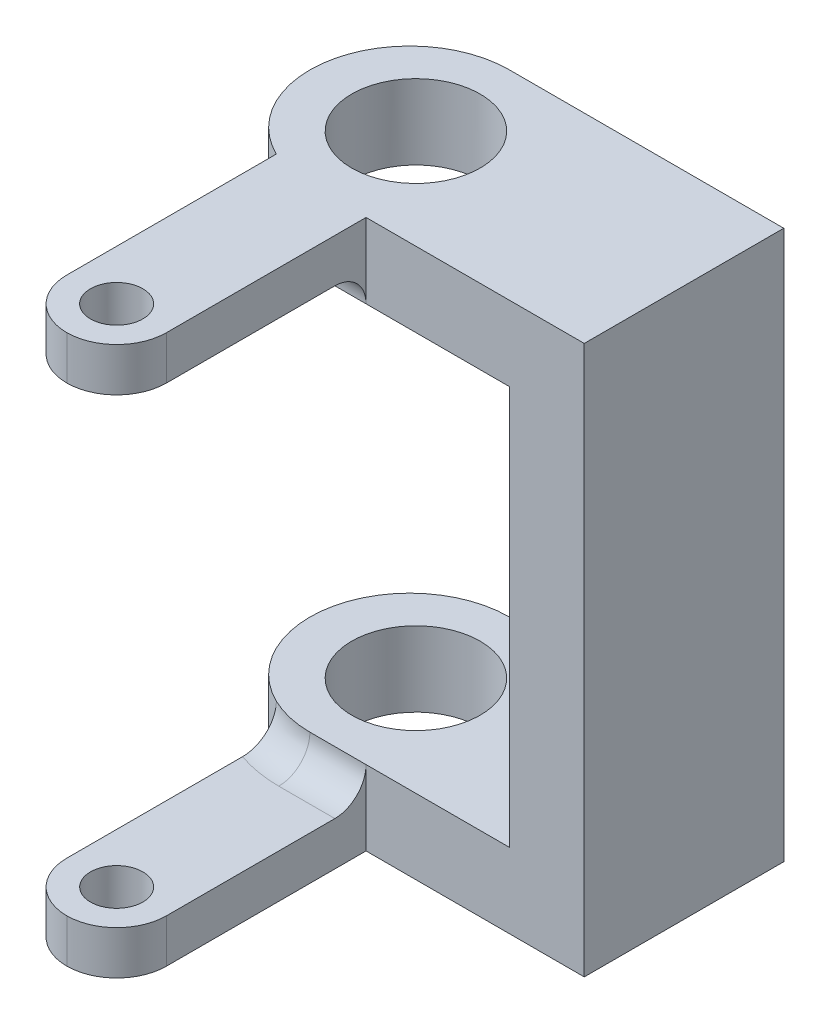
ISO-10303-21;
HEADER;
FILE_DESCRIPTION(('STEP AP214'),'2;1');
FILE_NAME('part.step','',(''),(''),'','','');
FILE_SCHEMA(('AUTOMOTIVE_DESIGN { 1 0 10303 214 1 1 1 1 }'));
ENDSEC;
DATA;
#1=APPLICATION_CONTEXT('core data for automotive mechanical design processes');
#2=APPLICATION_PROTOCOL_DEFINITION('international standard','automotive_design',2000,#1);
#3=PRODUCT_CONTEXT('',#1,'mechanical');
#4=PRODUCT('Part','Part','',(#3));
#5=PRODUCT_RELATED_PRODUCT_CATEGORY('part','',(#4));
#6=PRODUCT_DEFINITION_FORMATION('','',#4);
#7=PRODUCT_DEFINITION_CONTEXT('part definition',#1,'design');
#8=PRODUCT_DEFINITION('design','',#6,#7);
#9=PRODUCT_DEFINITION_SHAPE('','',#8);
#10=(LENGTH_UNIT() NAMED_UNIT(*) SI_UNIT(.MILLI.,.METRE.));
#11=(NAMED_UNIT(*) PLANE_ANGLE_UNIT() SI_UNIT($,.RADIAN.));
#12=(NAMED_UNIT(*) SI_UNIT($,.STERADIAN.) SOLID_ANGLE_UNIT());
#13=UNCERTAINTY_MEASURE_WITH_UNIT(LENGTH_MEASURE(1.E-05),#10,'distance_accuracy_value','');
#14=(GEOMETRIC_REPRESENTATION_CONTEXT(3) GLOBAL_UNCERTAINTY_ASSIGNED_CONTEXT((#13)) GLOBAL_UNIT_ASSIGNED_CONTEXT((#10,
#11,#12)) REPRESENTATION_CONTEXT('',''));
#15=CARTESIAN_POINT('',(0.,0.,0.));
#16=DIRECTION('',(0.,0.,1.));
#17=DIRECTION('',(1.,0.,0.));
#18=AXIS2_PLACEMENT_3D('',#15,#16,#17);
#19=CARTESIAN_POINT('',(-1.5,8.,4.));
#20=DIRECTION('',(0.,0.,-1.));
#21=DIRECTION('',(-1.,0.,0.));
#22=AXIS2_PLACEMENT_3D('',#19,#20,#21);
#23=PLANE('',#22);
#24=DIRECTION('',(1.,0.,0.));
#25=VECTOR('',#24,1.);
#26=CARTESIAN_POINT('',(1.5,-8.,4.));
#27=LINE('',#26,#25);
#28=CARTESIAN_POINT('',(-7.25,-8.,4.));
#29=VERTEX_POINT('',#28);
#30=CARTESIAN_POINT('',(-1.5,-8.,4.));
#31=VERTEX_POINT('',#30);
#32=EDGE_CURVE('E205',#29,#31,#27,.T.);
#33=ORIENTED_EDGE('',*,*,#32,.F.);
#34=DIRECTION('',(0.,-1.,0.));
#35=VECTOR('',#34,1.);
#36=CARTESIAN_POINT('',(-7.25,-9.25,4.));
#37=LINE('',#36,#35);
#38=CARTESIAN_POINT('',(-7.25,-11.,4.));
#39=VERTEX_POINT('',#38);
#40=EDGE_CURVE('E190',#29,#39,#37,.T.);
#41=ORIENTED_EDGE('',*,*,#40,.T.);
#42=DIRECTION('',(1.,0.,0.));
#43=VECTOR('',#42,1.);
#44=CARTESIAN_POINT('',(1.5,-11.,4.));
#45=LINE('',#44,#43);
#46=CARTESIAN_POINT('',(1.5,-11.,4.));
#47=VERTEX_POINT('',#46);
#48=EDGE_CURVE('E202',#39,#47,#45,.T.);
#49=ORIENTED_EDGE('',*,*,#48,.T.);
#50=DIRECTION('',(0.,-1.,0.));
#51=VECTOR('',#50,1.);
#52=CARTESIAN_POINT('',(1.5,8.,4.));
#53=LINE('',#52,#51);
#54=CARTESIAN_POINT('',(1.5,11.,4.));
#55=VERTEX_POINT('',#54);
#56=EDGE_CURVE('E278',#55,#47,#53,.T.);
#57=ORIENTED_EDGE('',*,*,#56,.F.);
#58=DIRECTION('',(1.,0.,0.));
#59=VECTOR('',#58,1.);
#60=CARTESIAN_POINT('',(1.5,11.,4.));
#61=LINE('',#60,#59);
#62=CARTESIAN_POINT('',(-7.25,11.,4.));
#63=VERTEX_POINT('',#62);
#64=EDGE_CURVE('E261',#63,#55,#61,.T.);
#65=ORIENTED_EDGE('',*,*,#64,.F.);
#66=DIRECTION('',(0.,1.,0.));
#67=VECTOR('',#66,1.);
#68=CARTESIAN_POINT('',(-7.25,9.25,4.));
#69=LINE('',#68,#67);
#70=CARTESIAN_POINT('',(-7.25,8.,4.));
#71=VERTEX_POINT('',#70);
#72=EDGE_CURVE('E238',#71,#63,#69,.T.);
#73=ORIENTED_EDGE('',*,*,#72,.F.);
#74=DIRECTION('',(1.,0.,0.));
#75=VECTOR('',#74,1.);
#76=CARTESIAN_POINT('',(1.5,8.,4.));
#77=LINE('',#76,#75);
#78=CARTESIAN_POINT('',(-1.5,8.,4.));
#79=VERTEX_POINT('',#78);
#80=EDGE_CURVE('E260',#71,#79,#77,.T.);
#81=ORIENTED_EDGE('',*,*,#80,.T.);
#82=DIRECTION('',(0.,-1.,0.));
#83=VECTOR('',#82,1.);
#84=CARTESIAN_POINT('',(-1.5,8.,4.));
#85=LINE('',#84,#83);
#86=EDGE_CURVE('E280',#79,#31,#85,.T.);
#87=ORIENTED_EDGE('',*,*,#86,.T.);
#88=EDGE_LOOP('',(#33,#41,#49,#57,#65,#73,#81,#87));
#89=FACE_BOUND('',#88,.T.);
#90=ADVANCED_FACE('F35',(#89),#23,.F.);
#91=CARTESIAN_POINT('',(-9.5,-11.,0.));
#92=DIRECTION('',(0.,-1.,0.));
#93=DIRECTION('',(0.,0.,-1.));
#94=AXIS2_PLACEMENT_3D('',#91,#92,#93);
#95=CYLINDRICAL_SURFACE('',#94,4.);
#96=DIRECTION('',(0.,1.,0.));
#97=VECTOR('',#96,1.);
#98=CARTESIAN_POINT('',(-11.25,-8.,3.59687364248454));
#99=LINE('',#98,#97);
#100=CARTESIAN_POINT('',(-11.25,-8.,3.59687364248454));
#101=VERTEX_POINT('',#100);
#102=CARTESIAN_POINT('',(-11.25,-11.,3.59687364248454));
#103=VERTEX_POINT('',#102);
#104=EDGE_CURVE('E52',#101,#103,#99,.F.);
#105=ORIENTED_EDGE('',*,*,#104,.F.);
#106=CARTESIAN_POINT('',(-9.5,-8.,0.));
#107=DIRECTION('',(0.,1.,0.));
#108=DIRECTION('',(0.,0.,1.));
#109=AXIS2_PLACEMENT_3D('',#106,#107,#108);
#110=CIRCLE('',#109,4.);
#111=CARTESIAN_POINT('',(-13.5,-8.,0.));
#112=VERTEX_POINT('',#111);
#113=EDGE_CURVE('E509',#112,#101,#110,.T.);
#114=ORIENTED_EDGE('',*,*,#113,.F.);
#115=DIRECTION('',(0.,1.,0.));
#116=VECTOR('',#115,1.);
#117=CARTESIAN_POINT('',(-13.5,-11.,0.));
#118=LINE('',#117,#116);
#119=CARTESIAN_POINT('',(-13.5,-11.,0.));
#120=VERTEX_POINT('',#119);
#121=EDGE_CURVE('E434',#112,#120,#118,.F.);
#122=ORIENTED_EDGE('',*,*,#121,.T.);
#123=CARTESIAN_POINT('',(-9.5,-11.,0.));
#124=DIRECTION('',(0.,1.,0.));
#125=DIRECTION('',(0.,0.,1.));
#126=AXIS2_PLACEMENT_3D('',#123,#124,#125);
#127=CIRCLE('',#126,4.);
#128=EDGE_CURVE('E425',#103,#120,#127,.F.);
#129=ORIENTED_EDGE('',*,*,#128,.F.);
#130=EDGE_LOOP('',(#105,#114,#122,#129));
#131=FACE_BOUND('',#130,.T.);
#132=ADVANCED_FACE('F366',(#131),#95,.T.);
#133=CARTESIAN_POINT('',(1.5,8.,4.));
#134=DIRECTION('',(-1.,0.,0.));
#135=DIRECTION('',(0.,0.,1.));
#136=AXIS2_PLACEMENT_3D('',#133,#134,#135);
#137=PLANE('',#136);
#138=ORIENTED_EDGE('',*,*,#56,.T.);
#139=DIRECTION('',(0.,0.,-1.));
#140=VECTOR('',#139,1.);
#141=CARTESIAN_POINT('',(1.5,-11.,4.));
#142=LINE('',#141,#140);
#143=CARTESIAN_POINT('',(1.5,-11.,-4.));
#144=VERTEX_POINT('',#143);
#145=EDGE_CURVE('E214',#47,#144,#142,.T.);
#146=ORIENTED_EDGE('',*,*,#145,.T.);
#147=DIRECTION('',(0.,-1.,0.));
#148=VECTOR('',#147,1.);
#149=CARTESIAN_POINT('',(1.5,8.,-4.));
#150=LINE('',#149,#148);
#151=CARTESIAN_POINT('',(1.5,11.,-4.));
#152=VERTEX_POINT('',#151);
#153=EDGE_CURVE('E285',#152,#144,#150,.T.);
#154=ORIENTED_EDGE('',*,*,#153,.F.);
#155=DIRECTION('',(0.,0.,-1.));
#156=VECTOR('',#155,1.);
#157=CARTESIAN_POINT('',(1.5,11.,4.));
#158=LINE('',#157,#156);
#159=EDGE_CURVE('E263',#55,#152,#158,.T.);
#160=ORIENTED_EDGE('',*,*,#159,.F.);
#161=EDGE_LOOP('',(#138,#146,#154,#160));
#162=FACE_BOUND('',#161,.T.);
#163=ADVANCED_FACE('F373',(#162),#137,.F.);
#164=CARTESIAN_POINT('',(-1.5,8.,-4.));
#165=DIRECTION('',(0.,0.,1.));
#166=DIRECTION('',(1.,0.,0.));
#167=AXIS2_PLACEMENT_3D('',#164,#165,#166);
#168=PLANE('',#167);
#169=DIRECTION('',(-1.,0.,0.));
#170=VECTOR('',#169,1.);
#171=CARTESIAN_POINT('',(-13.5,-11.,-4.));
#172=LINE('',#171,#170);
#173=CARTESIAN_POINT('',(-9.5,-11.,-4.));
#174=VERTEX_POINT('',#173);
#175=EDGE_CURVE('E215',#144,#174,#172,.T.);
#176=ORIENTED_EDGE('',*,*,#175,.T.);
#177=DIRECTION('',(0.,1.,0.));
#178=VECTOR('',#177,1.);
#179=CARTESIAN_POINT('',(-9.5,-8.,-4.));
#180=LINE('',#179,#178);
#181=CARTESIAN_POINT('',(-9.5,-8.,-4.));
#182=VERTEX_POINT('',#181);
#183=EDGE_CURVE('E421',#174,#182,#180,.T.);
#184=ORIENTED_EDGE('',*,*,#183,.T.);
#185=DIRECTION('',(-1.,0.,0.));
#186=VECTOR('',#185,1.);
#187=CARTESIAN_POINT('',(-13.5,-8.,-4.));
#188=LINE('',#187,#186);
#189=CARTESIAN_POINT('',(-1.5,-8.,-4.));
#190=VERTEX_POINT('',#189);
#191=EDGE_CURVE('E216',#190,#182,#188,.T.);
#192=ORIENTED_EDGE('',*,*,#191,.F.);
#193=DIRECTION('',(0.,-1.,0.));
#194=VECTOR('',#193,1.);
#195=CARTESIAN_POINT('',(-1.5,8.,-4.));
#196=LINE('',#195,#194);
#197=CARTESIAN_POINT('',(-1.5,8.,-4.));
#198=VERTEX_POINT('',#197);
#199=EDGE_CURVE('E282',#198,#190,#196,.T.);
#200=ORIENTED_EDGE('',*,*,#199,.F.);
#201=DIRECTION('',(-1.,0.,0.));
#202=VECTOR('',#201,1.);
#203=CARTESIAN_POINT('',(-13.5,8.,-4.));
#204=LINE('',#203,#202);
#205=CARTESIAN_POINT('',(-9.5,8.,-4.));
#206=VERTEX_POINT('',#205);
#207=EDGE_CURVE('E264',#198,#206,#204,.T.);
#208=ORIENTED_EDGE('',*,*,#207,.T.);
#209=DIRECTION('',(0.,-1.,0.));
#210=VECTOR('',#209,1.);
#211=CARTESIAN_POINT('',(-9.5,8.,-4.));
#212=LINE('',#211,#210);
#213=CARTESIAN_POINT('',(-9.5,11.,-4.));
#214=VERTEX_POINT('',#213);
#215=EDGE_CURVE('E298',#206,#214,#212,.F.);
#216=ORIENTED_EDGE('',*,*,#215,.T.);
#217=DIRECTION('',(-1.,0.,0.));
#218=VECTOR('',#217,1.);
#219=CARTESIAN_POINT('',(-13.5,11.,-4.));
#220=LINE('',#219,#218);
#221=EDGE_CURVE('E267',#152,#214,#220,.T.);
#222=ORIENTED_EDGE('',*,*,#221,.F.);
#223=ORIENTED_EDGE('',*,*,#153,.T.);
#224=EDGE_LOOP('',(#176,#184,#192,#200,#208,#216,#222,#223));
#225=FACE_BOUND('',#224,.T.);
#226=ADVANCED_FACE('F369',(#225),#168,.F.);
#227=CARTESIAN_POINT('',(-1.5,8.,4.));
#228=DIRECTION('',(1.,0.,0.));
#229=DIRECTION('',(0.,0.,-1.));
#230=AXIS2_PLACEMENT_3D('',#227,#228,#229);
#231=PLANE('',#230);
#232=ORIENTED_EDGE('',*,*,#199,.T.);
#233=DIRECTION('',(0.,0.,1.));
#234=VECTOR('',#233,1.);
#235=CARTESIAN_POINT('',(-1.5,-8.,4.));
#236=LINE('',#235,#234);
#237=EDGE_CURVE('E228',#190,#31,#236,.T.);
#238=ORIENTED_EDGE('',*,*,#237,.T.);
#239=ORIENTED_EDGE('',*,*,#86,.F.);
#240=DIRECTION('',(0.,0.,1.));
#241=VECTOR('',#240,1.);
#242=CARTESIAN_POINT('',(-1.5,8.,4.));
#243=LINE('',#242,#241);
#244=EDGE_CURVE('E270',#198,#79,#243,.T.);
#245=ORIENTED_EDGE('',*,*,#244,.F.);
#246=EDGE_LOOP('',(#232,#238,#239,#245));
#247=FACE_BOUND('',#246,.T.);
#248=ADVANCED_FACE('F359',(#247),#231,.F.);
#249=CARTESIAN_POINT('',(0.,11.,0.));
#250=DIRECTION('',(0.,-1.,0.));
#251=DIRECTION('',(0.,0.,-1.));
#252=AXIS2_PLACEMENT_3D('',#249,#250,#251);
#253=PLANE('',#252);
#254=CARTESIAN_POINT('',(-9.25,11.,12.));
#255=DIRECTION('',(0.,1.,0.));
#256=DIRECTION('',(0.,0.,1.));
#257=AXIS2_PLACEMENT_3D('',#254,#255,#256);
#258=CIRCLE('',#257,1.05);
#259=CARTESIAN_POINT('',(-9.25,11.,13.05));
#260=VERTEX_POINT('',#259);
#261=EDGE_CURVE('E233',#260,#260,#258,.T.);
#262=ORIENTED_EDGE('',*,*,#261,.F.);
#263=EDGE_LOOP('',(#262));
#264=FACE_BOUND('',#263,.T.);
#265=DIRECTION('',(0.,0.,1.));
#266=VECTOR('',#265,1.);
#267=CARTESIAN_POINT('',(-11.25,11.,-4.001));
#268=LINE('',#267,#266);
#269=CARTESIAN_POINT('',(-11.25,11.,3.59687364248454));
#270=VERTEX_POINT('',#269);
#271=CARTESIAN_POINT('',(-11.25,11.,12.));
#272=VERTEX_POINT('',#271);
#273=EDGE_CURVE('E246',#270,#272,#268,.T.);
#274=ORIENTED_EDGE('',*,*,#273,.T.);
#275=CARTESIAN_POINT('',(-9.25,11.,12.));
#276=DIRECTION('',(0.,-1.,0.));
#277=DIRECTION('',(0.,0.,-1.));
#278=AXIS2_PLACEMENT_3D('',#275,#276,#277);
#279=CIRCLE('',#278,2.);
#280=CARTESIAN_POINT('',(-9.25,11.,14.));
#281=VERTEX_POINT('',#280);
#282=EDGE_CURVE('E314',#272,#281,#279,.F.);
#283=ORIENTED_EDGE('',*,*,#282,.T.);
#284=CARTESIAN_POINT('',(-9.25,11.,12.));
#285=DIRECTION('',(0.,-1.,0.));
#286=DIRECTION('',(0.,0.,-1.));
#287=AXIS2_PLACEMENT_3D('',#284,#285,#286);
#288=CIRCLE('',#287,2.);
#289=CARTESIAN_POINT('',(-7.25,11.,12.));
#290=VERTEX_POINT('',#289);
#291=EDGE_CURVE('E312',#281,#290,#288,.F.);
#292=ORIENTED_EDGE('',*,*,#291,.T.);
#293=DIRECTION('',(0.,0.,-1.));
#294=VECTOR('',#293,1.);
#295=CARTESIAN_POINT('',(-7.25,11.,14.));
#296=LINE('',#295,#294);
#297=EDGE_CURVE('E244',#290,#63,#296,.T.);
#298=ORIENTED_EDGE('',*,*,#297,.T.);
#299=ORIENTED_EDGE('',*,*,#64,.T.);
#300=ORIENTED_EDGE('',*,*,#159,.T.);
#301=ORIENTED_EDGE('',*,*,#221,.T.);
#302=CARTESIAN_POINT('',(-9.5,11.,0.));
#303=DIRECTION('',(0.,-1.,0.));
#304=DIRECTION('',(0.,0.,-1.));
#305=AXIS2_PLACEMENT_3D('',#302,#303,#304);
#306=CIRCLE('',#305,4.);
#307=CARTESIAN_POINT('',(-13.5,11.,0.));
#308=VERTEX_POINT('',#307);
#309=EDGE_CURVE('E293',#214,#308,#306,.F.);
#310=ORIENTED_EDGE('',*,*,#309,.T.);
#311=CARTESIAN_POINT('',(-9.5,11.,0.));
#312=DIRECTION('',(0.,-1.,0.));
#313=DIRECTION('',(0.,0.,-1.));
#314=AXIS2_PLACEMENT_3D('',#311,#312,#313);
#315=CIRCLE('',#314,4.);
#316=EDGE_CURVE('E295',#308,#270,#315,.F.);
#317=ORIENTED_EDGE('',*,*,#316,.T.);
#318=EDGE_LOOP('',(#274,#283,#292,#298,#299,#300,#301,#310,#317));
#319=FACE_BOUND('',#318,.T.);
#320=CARTESIAN_POINT('',(-9.25,11.,0.));
#321=DIRECTION('',(0.,1.,0.));
#322=DIRECTION('',(0.,0.,1.));
#323=AXIS2_PLACEMENT_3D('',#320,#321,#322);
#324=CIRCLE('',#323,2.575);
#325=CARTESIAN_POINT('',(-9.25,11.,2.575));
#326=VERTEX_POINT('',#325);
#327=EDGE_CURVE('E254',#326,#326,#324,.T.);
#328=ORIENTED_EDGE('',*,*,#327,.F.);
#329=EDGE_LOOP('',(#328));
#330=FACE_BOUND('',#329,.T.);
#331=ADVANCED_FACE('F356',(#264,#319,#330),#253,.F.);
#332=CARTESIAN_POINT('',(0.,8.,0.));
#333=DIRECTION('',(0.,-1.,0.));
#334=DIRECTION('',(0.,0.,-1.));
#335=AXIS2_PLACEMENT_3D('',#332,#333,#334);
#336=PLANE('',#335);
#337=CARTESIAN_POINT('',(-9.25,8.,0.));
#338=DIRECTION('',(0.,-1.,0.));
#339=DIRECTION('',(0.,0.,-1.));
#340=AXIS2_PLACEMENT_3D('',#337,#338,#339);
#341=CIRCLE('',#340,2.575);
#342=CARTESIAN_POINT('',(-9.25,8.,-2.575));
#343=VERTEX_POINT('',#342);
#344=EDGE_CURVE('E257',#343,#343,#341,.F.);
#345=ORIENTED_EDGE('',*,*,#344,.T.);
#346=EDGE_LOOP('',(#345));
#347=FACE_BOUND('',#346,.T.);
#348=CARTESIAN_POINT('',(-9.5,8.,4.));
#349=VERTEX_POINT('',#348);
#350=EDGE_CURVE('E271',#349,#71,#77,.T.);
#351=ORIENTED_EDGE('',*,*,#350,.F.);
#352=CARTESIAN_POINT('',(-9.5,8.,0.));
#353=DIRECTION('',(0.,-1.,0.));
#354=DIRECTION('',(0.,0.,-1.));
#355=AXIS2_PLACEMENT_3D('',#352,#353,#354);
#356=CIRCLE('',#355,4.);
#357=CARTESIAN_POINT('',(-11.25,8.,3.59687364248454));
#358=VERTEX_POINT('',#357);
#359=EDGE_CURVE('E290',#349,#358,#356,.T.);
#360=ORIENTED_EDGE('',*,*,#359,.T.);
#361=CARTESIAN_POINT('',(-13.5,8.,0.));
#362=VERTEX_POINT('',#361);
#363=EDGE_CURVE('E289',#358,#362,#356,.T.);
#364=ORIENTED_EDGE('',*,*,#363,.T.);
#365=CARTESIAN_POINT('',(-9.5,8.,0.));
#366=DIRECTION('',(0.,-1.,0.));
#367=DIRECTION('',(0.,0.,-1.));
#368=AXIS2_PLACEMENT_3D('',#365,#366,#367);
#369=CIRCLE('',#368,4.);
#370=EDGE_CURVE('E287',#362,#206,#369,.T.);
#371=ORIENTED_EDGE('',*,*,#370,.T.);
#372=ORIENTED_EDGE('',*,*,#207,.F.);
#373=ORIENTED_EDGE('',*,*,#244,.T.);
#374=ORIENTED_EDGE('',*,*,#80,.F.);
#375=EDGE_LOOP('',(#351,#360,#364,#371,#372,#373,#374));
#376=FACE_BOUND('',#375,.T.);
#377=ADVANCED_FACE('F354',(#347,#376),#336,.T.);
#378=CARTESIAN_POINT('',(-9.25,0.716800153778559,0.));
#379=DIRECTION('',(0.,1.,0.));
#380=DIRECTION('',(0.,0.,1.));
#381=AXIS2_PLACEMENT_3D('',#378,#379,#380);
#382=CYLINDRICAL_SURFACE('',#381,2.575);
#383=ORIENTED_EDGE('',*,*,#327,.T.);
#384=EDGE_LOOP('',(#383));
#385=FACE_BOUND('',#384,.T.);
#386=ORIENTED_EDGE('',*,*,#344,.F.);
#387=EDGE_LOOP('',(#386));
#388=FACE_BOUND('',#387,.T.);
#389=ADVANCED_FACE('F350',(#385,#388),#382,.F.);
#390=CARTESIAN_POINT('',(-9.5,11.,0.));
#391=DIRECTION('',(0.,-1.,0.));
#392=DIRECTION('',(0.,0.,-1.));
#393=AXIS2_PLACEMENT_3D('',#390,#391,#392);
#394=CYLINDRICAL_SURFACE('',#393,4.);
#395=DIRECTION('',(0.,-1.,0.));
#396=VECTOR('',#395,1.);
#397=CARTESIAN_POINT('',(-13.5,11.,0.));
#398=LINE('',#397,#396);
#399=EDGE_CURVE('E249',#308,#362,#398,.T.);
#400=ORIENTED_EDGE('',*,*,#399,.F.);
#401=ORIENTED_EDGE('',*,*,#309,.F.);
#402=ORIENTED_EDGE('',*,*,#215,.F.);
#403=ORIENTED_EDGE('',*,*,#370,.F.);
#404=EDGE_LOOP('',(#400,#401,#402,#403));
#405=FACE_BOUND('',#404,.T.);
#406=ADVANCED_FACE('F353',(#405),#394,.T.);
#407=CARTESIAN_POINT('',(-9.5,8.,0.));
#408=DIRECTION('',(0.,-1.,0.));
#409=DIRECTION('',(0.,0.,-1.));
#410=AXIS2_PLACEMENT_3D('',#407,#408,#409);
#411=CYLINDRICAL_SURFACE('',#410,4.);
#412=ORIENTED_EDGE('',*,*,#363,.F.);
#413=DIRECTION('',(0.,-1.,0.));
#414=VECTOR('',#413,1.);
#415=CARTESIAN_POINT('',(-11.25,8.,3.59687364248454));
#416=LINE('',#415,#414);
#417=EDGE_CURVE('E247',#358,#270,#416,.F.);
#418=ORIENTED_EDGE('',*,*,#417,.T.);
#419=ORIENTED_EDGE('',*,*,#316,.F.);
#420=ORIENTED_EDGE('',*,*,#399,.T.);
#421=EDGE_LOOP('',(#412,#418,#419,#420));
#422=FACE_BOUND('',#421,.T.);
#423=ADVANCED_FACE('F347',(#422),#411,.T.);
#424=CARTESIAN_POINT('',(-11.25,9.25,-4.001));
#425=DIRECTION('',(-1.,0.,0.));
#426=DIRECTION('',(0.,0.,1.));
#427=AXIS2_PLACEMENT_3D('',#424,#425,#426);
#428=PLANE('',#427);
#429=ORIENTED_EDGE('',*,*,#417,.F.);
#430=CARTESIAN_POINT('',(-11.25,8.,3.59687364248454));
#431=CARTESIAN_POINT('',(-11.25,8.03285382070571,3.59687136274854));
#432=CARTESIAN_POINT('',(-11.25,8.06569057499022,3.59831512307628));
#433=CARTESIAN_POINT('',(-11.25,8.13110309937778,3.60405820508981));
#434=CARTESIAN_POINT('',(-11.25,8.16367894935715,3.60835661613467));
#435=CARTESIAN_POINT('',(-11.25,8.26040182911711,3.6254266946384));
#436=CARTESIAN_POINT('',(-11.25,8.32385771858036,3.6423739901484));
#437=CARTESIAN_POINT('',(-11.25,8.44694804912745,3.68657927447426));
#438=CARTESIAN_POINT('',(-11.25,8.5065855244126,3.71382895482262));
#439=CARTESIAN_POINT('',(-11.25,8.62077863355041,3.77750612996115));
#440=CARTESIAN_POINT('',(-11.25,8.67533024822094,3.81394080051723));
#441=CARTESIAN_POINT('',(-11.25,8.78071967178477,3.89665301634065));
#442=CARTESIAN_POINT('',(-11.25,8.83124929533803,3.94332206008511));
#443=CARTESIAN_POINT('',(-11.25,8.92456755404523,4.04383851665029));
#444=CARTESIAN_POINT('',(-11.25,8.96735365069338,4.09768827346195));
#445=CARTESIAN_POINT('',(-11.25,9.04800555413682,4.21632555255167));
#446=CARTESIAN_POINT('',(-11.25,9.08506309005717,4.28166302386002));
#447=CARTESIAN_POINT('',(-11.25,9.14838418739124,4.41737434213582));
#448=CARTESIAN_POINT('',(-11.25,9.17464653915845,4.487748752477));
#449=CARTESIAN_POINT('',(-11.25,9.21333244597027,4.62308217168031));
#450=CARTESIAN_POINT('',(-11.25,9.22703824284017,4.68767799632102));
#451=CARTESIAN_POINT('',(-11.25,9.24537644372357,4.81809035054269));
#452=CARTESIAN_POINT('',(-11.25,9.25001607260771,4.8839058658854));
#453=CARTESIAN_POINT('',(-11.25,9.25,4.94974746830583));
#454=B_SPLINE_CURVE_WITH_KNOTS('',3,(#430,#431,#432,#433,#434,#435,#436,#437,#438,#439,#440,
#441,#442,#443,#444,#445,#446,#447,#448,#449,#450,#451,#452,#453),.UNSPECIFIED.,.F.,.F.,(4,2,2,
2,2,2,2,2,2,2,2,4),(0.,0.0984965480749614,0.196961690580901,0.392964159090734,0.588808895341904,
0.784807111877935,0.990305728496831,1.19587159073072,1.42024428596953,1.64464211627848,
1.84211923115893,2.03943891134294),.UNSPECIFIED.);
#455=CARTESIAN_POINT('',(-11.25,9.25,4.94974746830584));
#456=VERTEX_POINT('',#455);
#457=EDGE_CURVE('E328',#358,#456,#454,.T.);
#458=ORIENTED_EDGE('',*,*,#457,.T.);
#459=DIRECTION('',(0.,0.,1.));
#460=VECTOR('',#459,1.);
#461=CARTESIAN_POINT('',(-11.25,9.25,-4.001));
#462=LINE('',#461,#460);
#463=CARTESIAN_POINT('',(-11.25,9.25,12.));
#464=VERTEX_POINT('',#463);
#465=EDGE_CURVE('E250',#456,#464,#462,.T.);
#466=ORIENTED_EDGE('',*,*,#465,.T.);
#467=DIRECTION('',(0.,-1.,0.));
#468=VECTOR('',#467,1.);
#469=CARTESIAN_POINT('',(-11.25,11.,12.));
#470=LINE('',#469,#468);
#471=EDGE_CURVE('E309',#464,#272,#470,.F.);
#472=ORIENTED_EDGE('',*,*,#471,.T.);
#473=ORIENTED_EDGE('',*,*,#273,.F.);
#474=EDGE_LOOP('',(#429,#458,#466,#472,#473));
#475=FACE_BOUND('',#474,.T.);
#476=ADVANCED_FACE('F341',(#475),#428,.T.);
#477=CARTESIAN_POINT('',(-11.25,9.25,-4.001));
#478=DIRECTION('',(0.,-1.,0.));
#479=DIRECTION('',(1.,0.,0.));
#480=AXIS2_PLACEMENT_3D('',#477,#478,#479);
#481=PLANE('',#480);
#482=CARTESIAN_POINT('',(-9.25,9.25,12.));
#483=DIRECTION('',(0.,-1.,0.));
#484=DIRECTION('',(1.,0.,0.));
#485=AXIS2_PLACEMENT_3D('',#482,#483,#484);
#486=CIRCLE('',#485,1.05);
#487=CARTESIAN_POINT('',(-8.2,9.25,12.));
#488=VERTEX_POINT('',#487);
#489=EDGE_CURVE('E236',#488,#488,#486,.T.);
#490=ORIENTED_EDGE('',*,*,#489,.F.);
#491=EDGE_LOOP('',(#490));
#492=FACE_BOUND('',#491,.T.);
#493=CARTESIAN_POINT('',(-9.5,9.25,0.));
#494=DIRECTION('',(0.,-1.,0.));
#495=DIRECTION('',(1.,0.,0.));
#496=AXIS2_PLACEMENT_3D('',#493,#494,#495);
#497=CIRCLE('',#496,5.25);
#498=CARTESIAN_POINT('',(-9.5,9.25,5.25));
#499=VERTEX_POINT('',#498);
#500=EDGE_CURVE('E318',#456,#499,#497,.F.);
#501=ORIENTED_EDGE('',*,*,#500,.T.);
#502=DIRECTION('',(1.,0.,0.));
#503=VECTOR('',#502,1.);
#504=CARTESIAN_POINT('',(-11.25,9.25,5.25));
#505=LINE('',#504,#503);
#506=CARTESIAN_POINT('',(-7.25,9.25,5.25));
#507=VERTEX_POINT('',#506);
#508=EDGE_CURVE('E322',#499,#507,#505,.T.);
#509=ORIENTED_EDGE('',*,*,#508,.T.);
#510=DIRECTION('',(0.,0.,-1.));
#511=VECTOR('',#510,1.);
#512=CARTESIAN_POINT('',(-7.25,9.25,14.));
#513=LINE('',#512,#511);
#514=CARTESIAN_POINT('',(-7.25,9.25,12.));
#515=VERTEX_POINT('',#514);
#516=EDGE_CURVE('E241',#515,#507,#513,.T.);
#517=ORIENTED_EDGE('',*,*,#516,.F.);
#518=CARTESIAN_POINT('',(-9.25,9.25,12.));
#519=DIRECTION('',(0.,-1.,0.));
#520=DIRECTION('',(1.,0.,0.));
#521=AXIS2_PLACEMENT_3D('',#518,#519,#520);
#522=CIRCLE('',#521,2.);
#523=CARTESIAN_POINT('',(-9.25,9.25,14.));
#524=VERTEX_POINT('',#523);
#525=EDGE_CURVE('E300',#515,#524,#522,.T.);
#526=ORIENTED_EDGE('',*,*,#525,.T.);
#527=CARTESIAN_POINT('',(-9.25,9.25,12.));
#528=DIRECTION('',(0.,-1.,0.));
#529=DIRECTION('',(1.,0.,0.));
#530=AXIS2_PLACEMENT_3D('',#527,#528,#529);
#531=CIRCLE('',#530,2.);
#532=EDGE_CURVE('E306',#524,#464,#531,.T.);
#533=ORIENTED_EDGE('',*,*,#532,.T.);
#534=ORIENTED_EDGE('',*,*,#465,.F.);
#535=EDGE_LOOP('',(#501,#509,#517,#526,#533,#534));
#536=FACE_BOUND('',#535,.T.);
#537=ADVANCED_FACE('F346',(#492,#536),#481,.T.);
#538=CARTESIAN_POINT('',(-7.25,9.25,14.));
#539=DIRECTION('',(-1.,0.,0.));
#540=DIRECTION('',(0.,0.,1.));
#541=AXIS2_PLACEMENT_3D('',#538,#539,#540);
#542=PLANE('',#541);
#543=ORIENTED_EDGE('',*,*,#297,.F.);
#544=DIRECTION('',(0.,1.,0.));
#545=VECTOR('',#544,1.);
#546=CARTESIAN_POINT('',(-7.25,9.25,12.));
#547=LINE('',#546,#545);
#548=EDGE_CURVE('E316',#290,#515,#547,.F.);
#549=ORIENTED_EDGE('',*,*,#548,.T.);
#550=ORIENTED_EDGE('',*,*,#516,.T.);
#551=CARTESIAN_POINT('',(-7.25,8.,5.25));
#552=DIRECTION('',(-1.,0.,0.));
#553=DIRECTION('',(0.,0.,1.));
#554=AXIS2_PLACEMENT_3D('',#551,#552,#553);
#555=CIRCLE('',#554,1.25);
#556=EDGE_CURVE('E325',#507,#71,#555,.T.);
#557=ORIENTED_EDGE('',*,*,#556,.T.);
#558=ORIENTED_EDGE('',*,*,#72,.T.);
#559=EDGE_LOOP('',(#543,#549,#550,#557,#558));
#560=FACE_BOUND('',#559,.T.);
#561=ADVANCED_FACE('F480',(#560),#542,.F.);
#562=CARTESIAN_POINT('',(-9.25,5.0301515190165,12.));
#563=DIRECTION('',(0.,1.,0.));
#564=DIRECTION('',(0.,0.,1.));
#565=AXIS2_PLACEMENT_3D('',#562,#563,#564);
#566=CYLINDRICAL_SURFACE('',#565,1.05);
#567=ORIENTED_EDGE('',*,*,#489,.T.);
#568=EDGE_LOOP('',(#567));
#569=FACE_BOUND('',#568,.T.);
#570=ORIENTED_EDGE('',*,*,#261,.T.);
#571=EDGE_LOOP('',(#570));
#572=FACE_BOUND('',#571,.T.);
#573=ADVANCED_FACE('F390',(#569,#572),#566,.F.);
#574=CARTESIAN_POINT('',(-9.25,0.,12.));
#575=DIRECTION('',(0.,1.,0.));
#576=DIRECTION('',(0.,0.,1.));
#577=AXIS2_PLACEMENT_3D('',#574,#575,#576);
#578=CYLINDRICAL_SURFACE('',#577,2.);
#579=ORIENTED_EDGE('',*,*,#548,.F.);
#580=ORIENTED_EDGE('',*,*,#291,.F.);
#581=DIRECTION('',(0.,1.,0.));
#582=VECTOR('',#581,1.);
#583=CARTESIAN_POINT('',(-9.25,0.,14.));
#584=LINE('',#583,#582);
#585=EDGE_CURVE('E237',#524,#281,#584,.T.);
#586=ORIENTED_EDGE('',*,*,#585,.F.);
#587=ORIENTED_EDGE('',*,*,#525,.F.);
#588=EDGE_LOOP('',(#579,#580,#586,#587));
#589=FACE_BOUND('',#588,.T.);
#590=ADVANCED_FACE('F387',(#589),#578,.T.);
#591=CARTESIAN_POINT('',(-9.25,0.,12.));
#592=DIRECTION('',(0.,1.,0.));
#593=DIRECTION('',(0.,0.,1.));
#594=AXIS2_PLACEMENT_3D('',#591,#592,#593);
#595=CYLINDRICAL_SURFACE('',#594,2.);
#596=ORIENTED_EDGE('',*,*,#282,.F.);
#597=ORIENTED_EDGE('',*,*,#471,.F.);
#598=ORIENTED_EDGE('',*,*,#532,.F.);
#599=ORIENTED_EDGE('',*,*,#585,.T.);
#600=EDGE_LOOP('',(#596,#597,#598,#599));
#601=FACE_BOUND('',#600,.T.);
#602=ADVANCED_FACE('F384',(#601),#595,.T.);
#603=CARTESIAN_POINT('',(-9.5,8.,0.));
#604=DIRECTION('',(0.,-1.,0.));
#605=DIRECTION('',(1.,0.,0.));
#606=AXIS2_PLACEMENT_3D('',#603,#604,#605);
#607=TOROIDAL_SURFACE('',#606,5.25,1.25);
#608=ORIENTED_EDGE('',*,*,#457,.F.);
#609=ORIENTED_EDGE('',*,*,#359,.F.);
#610=CARTESIAN_POINT('',(-9.5,8.,5.25));
#611=DIRECTION('',(-1.,0.,0.));
#612=DIRECTION('',(0.,0.,1.));
#613=AXIS2_PLACEMENT_3D('',#610,#611,#612);
#614=CIRCLE('',#613,1.25);
#615=EDGE_CURVE('E232',#499,#349,#614,.T.);
#616=ORIENTED_EDGE('',*,*,#615,.F.);
#617=ORIENTED_EDGE('',*,*,#500,.F.);
#618=EDGE_LOOP('',(#608,#609,#616,#617));
#619=FACE_BOUND('',#618,.T.);
#620=ADVANCED_FACE('F337',(#619),#607,.F.);
#621=CARTESIAN_POINT('',(-11.25,8.,5.25));
#622=DIRECTION('',(1.,0.,0.));
#623=DIRECTION('',(0.,1.,0.));
#624=AXIS2_PLACEMENT_3D('',#621,#622,#623);
#625=CYLINDRICAL_SURFACE('',#624,1.25);
#626=ORIENTED_EDGE('',*,*,#615,.T.);
#627=ORIENTED_EDGE('',*,*,#350,.T.);
#628=ORIENTED_EDGE('',*,*,#556,.F.);
#629=ORIENTED_EDGE('',*,*,#508,.F.);
#630=EDGE_LOOP('',(#626,#627,#628,#629));
#631=FACE_BOUND('',#630,.T.);
#632=ADVANCED_FACE('F392',(#631),#625,.F.);
#633=CARTESIAN_POINT('',(0.,-8.,0.));
#634=DIRECTION('',(0.,1.,0.));
#635=DIRECTION('',(0.,0.,-1.));
#636=AXIS2_PLACEMENT_3D('',#633,#634,#635);
#637=PLANE('',#636);
#638=CARTESIAN_POINT('',(-9.25,-8.,0.));
#639=DIRECTION('',(0.,1.,0.));
#640=DIRECTION('',(0.,0.,1.));
#641=AXIS2_PLACEMENT_3D('',#638,#639,#640);
#642=CIRCLE('',#641,2.575);
#643=CARTESIAN_POINT('',(-9.25,-8.,-2.575));
#644=VERTEX_POINT('',#643);
#645=EDGE_CURVE('E224',#644,#644,#642,.T.);
#646=ORIENTED_EDGE('',*,*,#645,.F.);
#647=EDGE_LOOP('',(#646));
#648=FACE_BOUND('',#647,.T.);
#649=CARTESIAN_POINT('',(-9.5,-8.,0.));
#650=DIRECTION('',(0.,1.,0.));
#651=DIRECTION('',(0.,0.,1.));
#652=AXIS2_PLACEMENT_3D('',#649,#650,#651);
#653=CIRCLE('',#652,4.);
#654=EDGE_CURVE('E335',#182,#112,#653,.T.);
#655=ORIENTED_EDGE('',*,*,#654,.T.);
#656=ORIENTED_EDGE('',*,*,#113,.T.);
#657=CARTESIAN_POINT('',(-9.5,-8.,4.));
#658=VERTEX_POINT('',#657);
#659=EDGE_CURVE('E511',#101,#658,#110,.T.);
#660=ORIENTED_EDGE('',*,*,#659,.T.);
#661=EDGE_CURVE('E221',#658,#29,#27,.T.);
#662=ORIENTED_EDGE('',*,*,#661,.T.);
#663=ORIENTED_EDGE('',*,*,#32,.T.);
#664=ORIENTED_EDGE('',*,*,#237,.F.);
#665=ORIENTED_EDGE('',*,*,#191,.T.);
#666=EDGE_LOOP('',(#655,#656,#660,#662,#663,#664,#665));
#667=FACE_BOUND('',#666,.T.);
#668=ADVANCED_FACE('F394',(#648,#667),#637,.T.);
#669=CARTESIAN_POINT('',(0.,-11.,0.));
#670=DIRECTION('',(0.,1.,0.));
#671=DIRECTION('',(0.,0.,-1.));
#672=AXIS2_PLACEMENT_3D('',#669,#670,#671);
#673=PLANE('',#672);
#674=CARTESIAN_POINT('',(-9.25,-11.,12.));
#675=DIRECTION('',(0.,1.,0.));
#676=DIRECTION('',(0.,0.,1.));
#677=AXIS2_PLACEMENT_3D('',#674,#675,#676);
#678=CIRCLE('',#677,1.05);
#679=CARTESIAN_POINT('',(-9.25,-11.,13.05));
#680=VERTEX_POINT('',#679);
#681=EDGE_CURVE('E440',#680,#680,#678,.T.);
#682=ORIENTED_EDGE('',*,*,#681,.T.);
#683=EDGE_LOOP('',(#682));
#684=FACE_BOUND('',#683,.T.);
#685=CARTESIAN_POINT('',(-9.25,-11.,12.));
#686=DIRECTION('',(0.,1.,0.));
#687=DIRECTION('',(0.,0.,1.));
#688=AXIS2_PLACEMENT_3D('',#685,#686,#687);
#689=CIRCLE('',#688,2.);
#690=CARTESIAN_POINT('',(-7.25,-11.,12.));
#691=VERTEX_POINT('',#690);
#692=CARTESIAN_POINT('',(-9.25,-11.,14.));
#693=VERTEX_POINT('',#692);
#694=EDGE_CURVE('E445',#691,#693,#689,.F.);
#695=ORIENTED_EDGE('',*,*,#694,.T.);
#696=CARTESIAN_POINT('',(-9.25,-11.,12.));
#697=DIRECTION('',(0.,1.,0.));
#698=DIRECTION('',(0.,0.,1.));
#699=AXIS2_PLACEMENT_3D('',#696,#697,#698);
#700=CIRCLE('',#699,2.);
#701=CARTESIAN_POINT('',(-11.25,-11.,12.));
#702=VERTEX_POINT('',#701);
#703=EDGE_CURVE('E447',#693,#702,#700,.F.);
#704=ORIENTED_EDGE('',*,*,#703,.T.);
#705=DIRECTION('',(0.,0.,1.));
#706=VECTOR('',#705,1.);
#707=CARTESIAN_POINT('',(-11.25,-11.,-4.001));
#708=LINE('',#707,#706);
#709=EDGE_CURVE('E438',#103,#702,#708,.T.);
#710=ORIENTED_EDGE('',*,*,#709,.F.);
#711=ORIENTED_EDGE('',*,*,#128,.T.);
#712=CARTESIAN_POINT('',(-9.5,-11.,0.));
#713=DIRECTION('',(0.,1.,0.));
#714=DIRECTION('',(0.,0.,1.));
#715=AXIS2_PLACEMENT_3D('',#712,#713,#714);
#716=CIRCLE('',#715,4.);
#717=EDGE_CURVE('E430',#120,#174,#716,.F.);
#718=ORIENTED_EDGE('',*,*,#717,.T.);
#719=ORIENTED_EDGE('',*,*,#175,.F.);
#720=ORIENTED_EDGE('',*,*,#145,.F.);
#721=ORIENTED_EDGE('',*,*,#48,.F.);
#722=DIRECTION('',(0.,0.,-1.));
#723=VECTOR('',#722,1.);
#724=CARTESIAN_POINT('',(-7.25,-11.,14.));
#725=LINE('',#724,#723);
#726=EDGE_CURVE('E186',#691,#39,#725,.T.);
#727=ORIENTED_EDGE('',*,*,#726,.F.);
#728=EDGE_LOOP('',(#695,#704,#710,#711,#718,#719,#720,#721,#727));
#729=FACE_BOUND('',#728,.T.);
#730=CARTESIAN_POINT('',(-9.25,-11.,0.));
#731=DIRECTION('',(0.,1.,0.));
#732=DIRECTION('',(0.,0.,1.));
#733=AXIS2_PLACEMENT_3D('',#730,#731,#732);
#734=CIRCLE('',#733,2.575);
#735=CARTESIAN_POINT('',(-9.25,-11.,-2.575));
#736=VERTEX_POINT('',#735);
#737=EDGE_CURVE('E437',#736,#736,#734,.T.);
#738=ORIENTED_EDGE('',*,*,#737,.T.);
#739=EDGE_LOOP('',(#738));
#740=FACE_BOUND('',#739,.T.);
#741=ADVANCED_FACE('F210',(#684,#729,#740),#673,.F.);
#742=CARTESIAN_POINT('',(-9.25,15.2831998462214,0.));
#743=DIRECTION('',(0.,-1.,0.));
#744=DIRECTION('',(0.,0.,-1.));
#745=AXIS2_PLACEMENT_3D('',#742,#743,#744);
#746=CYLINDRICAL_SURFACE('',#745,2.575);
#747=CARTESIAN_POINT('',(-9.25,-11.,-2.575));
#748=CARTESIAN_POINT('',(-9.25,-10.96875,-2.575));
#749=CARTESIAN_POINT('',(-9.25,-10.9375,-2.575));
#750=CARTESIAN_POINT('',(-9.25,-10.875,-2.575));
#751=CARTESIAN_POINT('',(-9.25,-10.84375,-2.575));
#752=CARTESIAN_POINT('',(-9.25,-10.78125,-2.575));
#753=CARTESIAN_POINT('',(-9.25,-10.75,-2.575));
#754=CARTESIAN_POINT('',(-9.25,-10.6875,-2.575));
#755=CARTESIAN_POINT('',(-9.25,-10.65625,-2.575));
#756=CARTESIAN_POINT('',(-9.25,-10.59375,-2.575));
#757=CARTESIAN_POINT('',(-9.25,-10.5625,-2.575));
#758=CARTESIAN_POINT('',(-9.25,-10.5,-2.575));
#759=CARTESIAN_POINT('',(-9.25,-10.46875,-2.575));
#760=CARTESIAN_POINT('',(-9.25,-10.40625,-2.575));
#761=CARTESIAN_POINT('',(-9.25,-10.375,-2.575));
#762=CARTESIAN_POINT('',(-9.25,-10.3125,-2.575));
#763=CARTESIAN_POINT('',(-9.25,-10.28125,-2.575));
#764=CARTESIAN_POINT('',(-9.25,-10.21875,-2.575));
#765=CARTESIAN_POINT('',(-9.25,-10.1875,-2.575));
#766=CARTESIAN_POINT('',(-9.25,-10.125,-2.575));
#767=CARTESIAN_POINT('',(-9.25,-10.09375,-2.575));
#768=CARTESIAN_POINT('',(-9.25,-10.03125,-2.575));
#769=CARTESIAN_POINT('',(-9.25,-10.,-2.575));
#770=CARTESIAN_POINT('',(-9.25,-9.9375,-2.575));
#771=CARTESIAN_POINT('',(-9.25,-9.90625,-2.575));
#772=CARTESIAN_POINT('',(-9.25,-9.84375,-2.575));
#773=CARTESIAN_POINT('',(-9.25,-9.8125,-2.575));
#774=CARTESIAN_POINT('',(-9.25,-9.75,-2.575));
#775=CARTESIAN_POINT('',(-9.25,-9.71875,-2.575));
#776=CARTESIAN_POINT('',(-9.25,-9.65625,-2.575));
#777=CARTESIAN_POINT('',(-9.25,-9.625,-2.575));
#778=CARTESIAN_POINT('',(-9.25,-9.5625,-2.575));
#779=CARTESIAN_POINT('',(-9.25,-9.53125,-2.575));
#780=CARTESIAN_POINT('',(-9.25,-9.46875,-2.575));
#781=CARTESIAN_POINT('',(-9.25,-9.4375,-2.575));
#782=CARTESIAN_POINT('',(-9.25,-9.375,-2.575));
#783=CARTESIAN_POINT('',(-9.25,-9.34375,-2.575));
#784=CARTESIAN_POINT('',(-9.25,-9.28125,-2.575));
#785=CARTESIAN_POINT('',(-9.25,-9.25,-2.575));
#786=CARTESIAN_POINT('',(-9.25,-9.1875,-2.575));
#787=CARTESIAN_POINT('',(-9.25,-9.15625,-2.575));
#788=CARTESIAN_POINT('',(-9.25,-9.09375,-2.575));
#789=CARTESIAN_POINT('',(-9.25,-9.0625,-2.575));
#790=CARTESIAN_POINT('',(-9.25,-9.,-2.575));
#791=CARTESIAN_POINT('',(-9.25,-8.96875,-2.575));
#792=CARTESIAN_POINT('',(-9.25,-8.90625,-2.575));
#793=CARTESIAN_POINT('',(-9.25,-8.875,-2.575));
#794=CARTESIAN_POINT('',(-9.25,-8.8125,-2.575));
#795=CARTESIAN_POINT('',(-9.25,-8.78125,-2.575));
#796=CARTESIAN_POINT('',(-9.25,-8.71875,-2.575));
#797=CARTESIAN_POINT('',(-9.25,-8.6875,-2.575));
#798=CARTESIAN_POINT('',(-9.25,-8.625,-2.575));
#799=CARTESIAN_POINT('',(-9.25,-8.59375,-2.575));
#800=CARTESIAN_POINT('',(-9.25,-8.53125,-2.575));
#801=CARTESIAN_POINT('',(-9.25,-8.5,-2.575));
#802=CARTESIAN_POINT('',(-9.25,-8.4375,-2.575));
#803=CARTESIAN_POINT('',(-9.25,-8.40625,-2.575));
#804=CARTESIAN_POINT('',(-9.25,-8.34375,-2.575));
#805=CARTESIAN_POINT('',(-9.25,-8.3125,-2.575));
#806=CARTESIAN_POINT('',(-9.25,-8.25,-2.575));
#807=CARTESIAN_POINT('',(-9.25,-8.21875,-2.575));
#808=CARTESIAN_POINT('',(-9.25,-8.15625,-2.575));
#809=CARTESIAN_POINT('',(-9.25,-8.125,-2.575));
#810=CARTESIAN_POINT('',(-9.25,-8.0625,-2.575));
#811=CARTESIAN_POINT('',(-9.25,-8.03125,-2.575));
#812=CARTESIAN_POINT('',(-9.25,-8.,-2.575));
#813=B_SPLINE_CURVE_WITH_KNOTS('',3,(#747,#748,#749,#750,#751,#752,#753,#754,#755,#756,#757,
#758,#759,#760,#761,#762,#763,#764,#765,#766,#767,#768,#769,#770,#771,#772,#773,#774,#775,#776,
#777,#778,#779,#780,#781,#782,#783,#784,#785,#786,#787,#788,#789,#790,#791,#792,#793,#794,#795,
#796,#797,#798,#799,#800,#801,#802,#803,#804,#805,#806,#807,#808,#809,#810,#811,#812),
.UNSPECIFIED.,.F.,.F.,(4,2,2,2,2,2,2,2,2,2,2,2,2,2,2,2,2,2,2,2,2,2,2,2,2,2,2,2,2,2,2,2,4),(0.,
0.0937500000000001,0.1875,0.28125,0.375,0.46875,0.5625,0.656250000000001,0.750000000000001,
0.843749999999997,0.937499999999997,1.03125,1.125,1.21875,1.3125,1.40625,1.5,1.59375,1.6875,
1.78125,1.875,1.96875,2.0625,2.15625,2.25,2.34375,2.4375,2.53125,2.625,2.71875,2.8125,2.90625,
3.),.UNSPECIFIED.);
#814=EDGE_CURVE('BSEAM472',#736,#644,#813,.T.);
#815=ORIENTED_EDGE('',*,*,#737,.F.);
#816=ORIENTED_EDGE('',*,*,#645,.T.);
#817=ORIENTED_EDGE('',*,*,#814,.T.);
#818=ORIENTED_EDGE('',*,*,#814,.F.);
#819=EDGE_LOOP('',(#815,#817,#816,#818));
#820=FACE_BOUND('',#819,.T.);
#821=ADVANCED_FACE('F472',(#820),#746,.F.);
#822=CARTESIAN_POINT('',(-9.5,8.,0.));
#823=DIRECTION('',(0.,-1.,0.));
#824=DIRECTION('',(0.,0.,-1.));
#825=AXIS2_PLACEMENT_3D('',#822,#823,#824);
#826=CYLINDRICAL_SURFACE('',#825,4.);
#827=ORIENTED_EDGE('',*,*,#183,.F.);
#828=ORIENTED_EDGE('',*,*,#717,.F.);
#829=ORIENTED_EDGE('',*,*,#121,.F.);
#830=ORIENTED_EDGE('',*,*,#654,.F.);
#831=EDGE_LOOP('',(#827,#828,#829,#830));
#832=FACE_BOUND('',#831,.T.);
#833=ADVANCED_FACE('F470',(#832),#826,.T.);
#834=CARTESIAN_POINT('',(-11.25,-9.25,-4.001));
#835=DIRECTION('',(0.,-1.,0.));
#836=DIRECTION('',(1.,0.,0.));
#837=AXIS2_PLACEMENT_3D('',#834,#835,#836);
#838=PLANE('',#837);
#839=CARTESIAN_POINT('',(-9.25,-9.25,12.));
#840=DIRECTION('',(0.,-1.,0.));
#841=DIRECTION('',(1.,0.,0.));
#842=AXIS2_PLACEMENT_3D('',#839,#840,#841);
#843=CIRCLE('',#842,1.05);
#844=CARTESIAN_POINT('',(-8.2,-9.25,12.));
#845=VERTEX_POINT('',#844);
#846=EDGE_CURVE('E207',#845,#845,#843,.F.);
#847=ORIENTED_EDGE('',*,*,#846,.F.);
#848=EDGE_LOOP('',(#847));
#849=FACE_BOUND('',#848,.T.);
#850=DIRECTION('',(0.,0.,-1.));
#851=VECTOR('',#850,1.);
#852=CARTESIAN_POINT('',(-7.25,-9.25,14.));
#853=LINE('',#852,#851);
#854=CARTESIAN_POINT('',(-7.25,-9.25,12.));
#855=VERTEX_POINT('',#854);
#856=CARTESIAN_POINT('',(-7.25,-9.25,5.25));
#857=VERTEX_POINT('',#856);
#858=EDGE_CURVE('E197',#855,#857,#853,.T.);
#859=ORIENTED_EDGE('',*,*,#858,.T.);
#860=DIRECTION('',(1.,0.,0.));
#861=VECTOR('',#860,1.);
#862=CARTESIAN_POINT('',(-9.5,-9.25,5.25));
#863=LINE('',#862,#861);
#864=CARTESIAN_POINT('',(-9.5,-9.25,5.25));
#865=VERTEX_POINT('',#864);
#866=EDGE_CURVE('E59',#857,#865,#863,.F.);
#867=ORIENTED_EDGE('',*,*,#866,.T.);
#868=CARTESIAN_POINT('',(-9.5,-9.25,0.));
#869=DIRECTION('',(0.,-1.,0.));
#870=DIRECTION('',(1.,0.,0.));
#871=AXIS2_PLACEMENT_3D('',#868,#869,#870);
#872=CIRCLE('',#871,5.25);
#873=CARTESIAN_POINT('',(-11.25,-9.25,4.94974746830584));
#874=VERTEX_POINT('',#873);
#875=EDGE_CURVE('E450',#865,#874,#872,.T.);
#876=ORIENTED_EDGE('',*,*,#875,.T.);
#877=DIRECTION('',(0.,0.,1.));
#878=VECTOR('',#877,1.);
#879=CARTESIAN_POINT('',(-11.25,-9.25,-4.001));
#880=LINE('',#879,#878);
#881=CARTESIAN_POINT('',(-11.25,-9.25,12.));
#882=VERTEX_POINT('',#881);
#883=EDGE_CURVE('E522',#874,#882,#880,.T.);
#884=ORIENTED_EDGE('',*,*,#883,.T.);
#885=CARTESIAN_POINT('',(-9.25,-9.25,12.));
#886=DIRECTION('',(0.,-1.,0.));
#887=DIRECTION('',(1.,0.,0.));
#888=AXIS2_PLACEMENT_3D('',#885,#886,#887);
#889=CIRCLE('',#888,2.);
#890=CARTESIAN_POINT('',(-9.25,-9.25,14.));
#891=VERTEX_POINT('',#890);
#892=EDGE_CURVE('E443',#882,#891,#889,.F.);
#893=ORIENTED_EDGE('',*,*,#892,.T.);
#894=CARTESIAN_POINT('',(-9.25,-9.25,12.));
#895=DIRECTION('',(0.,-1.,0.));
#896=DIRECTION('',(1.,0.,0.));
#897=AXIS2_PLACEMENT_3D('',#894,#895,#896);
#898=CIRCLE('',#897,2.);
#899=EDGE_CURVE('E428',#891,#855,#898,.F.);
#900=ORIENTED_EDGE('',*,*,#899,.T.);
#901=EDGE_LOOP('',(#859,#867,#876,#884,#893,#900));
#902=FACE_BOUND('',#901,.T.);
#903=ADVANCED_FACE('F465',(#849,#902),#838,.F.);
#904=CARTESIAN_POINT('',(-11.25,-9.25,-4.001));
#905=DIRECTION('',(1.,0.,0.));
#906=DIRECTION('',(0.,0.,-1.));
#907=AXIS2_PLACEMENT_3D('',#904,#905,#906);
#908=PLANE('',#907);
#909=ORIENTED_EDGE('',*,*,#709,.T.);
#910=DIRECTION('',(0.,1.,0.));
#911=VECTOR('',#910,1.);
#912=CARTESIAN_POINT('',(-11.25,-9.25,12.));
#913=LINE('',#912,#911);
#914=EDGE_CURVE('E424',#702,#882,#913,.T.);
#915=ORIENTED_EDGE('',*,*,#914,.T.);
#916=ORIENTED_EDGE('',*,*,#883,.F.);
#917=CARTESIAN_POINT('',(-11.25,-9.25,4.94974746830583));
#918=CARTESIAN_POINT('',(-11.25,-9.25003895289656,4.86992956525657));
#919=CARTESIAN_POINT('',(-11.25,-9.24320643409134,4.79014321688747));
#920=CARTESIAN_POINT('',(-11.25,-9.2163201108722,4.63281488112474));
#921=CARTESIAN_POINT('',(-11.25,-9.19626453468692,4.55527319594956));
#922=CARTESIAN_POINT('',(-11.25,-9.14344625724108,4.40461585242023));
#923=CARTESIAN_POINT('',(-11.25,-9.11067981985818,4.33150150271109));
#924=CARTESIAN_POINT('',(-11.25,-9.03320881095768,4.19188903179819));
#925=CARTESIAN_POINT('',(-11.25,-8.98850604850688,4.12538991008645));
#926=CARTESIAN_POINT('',(-11.25,-8.88875457082965,4.00199009477358));
#927=CARTESIAN_POINT('',(-11.25,-8.83384041477052,3.94498102510398));
#928=CARTESIAN_POINT('',(-11.25,-8.71455810203194,3.84182278857238));
#929=CARTESIAN_POINT('',(-11.25,-8.65019146320862,3.79567188122397));
#930=CARTESIAN_POINT('',(-11.25,-8.51864319866501,3.71931464013519));
#931=CARTESIAN_POINT('',(-11.25,-8.45198245453518,3.68821161029617));
#932=CARTESIAN_POINT('',(-11.25,-8.31407732478932,3.639042745222));
#933=CARTESIAN_POINT('',(-11.25,-8.24284355329897,3.62094783026275));
#934=CARTESIAN_POINT('',(-11.25,-8.14239094062494,3.60555349033879));
#935=CARTESIAN_POINT('',(-11.25,-8.11399310018197,3.60230036287039));
#936=CARTESIAN_POINT('',(-11.25,-8.05706890900056,3.59796235832025));
#937=CARTESIAN_POINT('',(-11.25,-8.02854276937869,3.59687471017357));
#938=CARTESIAN_POINT('',(-11.25,-7.99999999999998,3.59687364248466));
#939=B_SPLINE_CURVE_WITH_KNOTS('',3,(#917,#918,#919,#920,#921,#922,#923,#924,#925,#926,#927,
#928,#929,#930,#931,#932,#933,#934,#935,#936,#937,#938),.UNSPECIFIED.,.F.,.F.,(4,2,2,2,2,2,2,2,
2,2,4),(0.,0.239120924610696,0.478273895798356,0.717497214902133,0.956684297931396,
1.19291807906639,1.42911396776404,1.64860830949954,1.86761043132206,1.95329489690984,
2.03886964534847),.UNSPECIFIED.);
#940=EDGE_CURVE('E11',#874,#101,#939,.T.);
#941=ORIENTED_EDGE('',*,*,#940,.T.);
#942=ORIENTED_EDGE('',*,*,#104,.T.);
#943=EDGE_LOOP('',(#909,#915,#916,#941,#942));
#944=FACE_BOUND('',#943,.T.);
#945=ADVANCED_FACE('F460',(#944),#908,.F.);
#946=CARTESIAN_POINT('',(-7.25,-9.25,14.));
#947=DIRECTION('',(1.,0.,0.));
#948=DIRECTION('',(0.,0.,-1.));
#949=AXIS2_PLACEMENT_3D('',#946,#947,#948);
#950=PLANE('',#949);
#951=ORIENTED_EDGE('',*,*,#858,.F.);
#952=DIRECTION('',(0.,-1.,0.));
#953=VECTOR('',#952,1.);
#954=CARTESIAN_POINT('',(-7.25,-11.,12.));
#955=LINE('',#954,#953);
#956=EDGE_CURVE('E193',#855,#691,#955,.T.);
#957=ORIENTED_EDGE('',*,*,#956,.T.);
#958=ORIENTED_EDGE('',*,*,#726,.T.);
#959=ORIENTED_EDGE('',*,*,#40,.F.);
#960=CARTESIAN_POINT('',(-7.25,-8.,5.25));
#961=DIRECTION('',(1.,0.,0.));
#962=DIRECTION('',(0.,0.,-1.));
#963=AXIS2_PLACEMENT_3D('',#960,#961,#962);
#964=CIRCLE('',#963,1.25);
#965=EDGE_CURVE('E45',#29,#857,#964,.F.);
#966=ORIENTED_EDGE('',*,*,#965,.T.);
#967=EDGE_LOOP('',(#951,#957,#958,#959,#966));
#968=FACE_BOUND('',#967,.T.);
#969=ADVANCED_FACE('F189',(#968),#950,.T.);
#970=CARTESIAN_POINT('',(-9.25,10.9698484809835,12.));
#971=DIRECTION('',(0.,-1.,0.));
#972=DIRECTION('',(0.,0.,-1.));
#973=AXIS2_PLACEMENT_3D('',#970,#971,#972);
#974=CYLINDRICAL_SURFACE('',#973,1.05);
#975=ORIENTED_EDGE('',*,*,#681,.F.);
#976=EDGE_LOOP('',(#975));
#977=FACE_BOUND('',#976,.T.);
#978=ORIENTED_EDGE('',*,*,#846,.T.);
#979=EDGE_LOOP('',(#978));
#980=FACE_BOUND('',#979,.T.);
#981=ADVANCED_FACE('F543',(#977,#980),#974,.F.);
#982=CARTESIAN_POINT('',(-9.25,-9.25,12.));
#983=DIRECTION('',(0.,1.,0.));
#984=DIRECTION('',(0.,0.,1.));
#985=AXIS2_PLACEMENT_3D('',#982,#983,#984);
#986=CYLINDRICAL_SURFACE('',#985,2.);
#987=DIRECTION('',(0.,-1.,0.));
#988=VECTOR('',#987,1.);
#989=CARTESIAN_POINT('',(-9.25,-9.25,14.));
#990=LINE('',#989,#988);
#991=EDGE_CURVE('E451',#693,#891,#990,.F.);
#992=ORIENTED_EDGE('',*,*,#991,.F.);
#993=ORIENTED_EDGE('',*,*,#694,.F.);
#994=ORIENTED_EDGE('',*,*,#956,.F.);
#995=ORIENTED_EDGE('',*,*,#899,.F.);
#996=EDGE_LOOP('',(#992,#993,#994,#995));
#997=FACE_BOUND('',#996,.T.);
#998=ADVANCED_FACE('F541',(#997),#986,.T.);
#999=CARTESIAN_POINT('',(-9.25,-9.25,12.));
#1000=DIRECTION('',(0.,1.,0.));
#1001=DIRECTION('',(0.,0.,1.));
#1002=AXIS2_PLACEMENT_3D('',#999,#1000,#1001);
#1003=CYLINDRICAL_SURFACE('',#1002,2.);
#1004=ORIENTED_EDGE('',*,*,#703,.F.);
#1005=ORIENTED_EDGE('',*,*,#991,.T.);
#1006=ORIENTED_EDGE('',*,*,#892,.F.);
#1007=ORIENTED_EDGE('',*,*,#914,.F.);
#1008=EDGE_LOOP('',(#1004,#1005,#1006,#1007));
#1009=FACE_BOUND('',#1008,.T.);
#1010=ADVANCED_FACE('F538',(#1009),#1003,.T.);
#1011=CARTESIAN_POINT('',(-9.5,-8.,0.));
#1012=DIRECTION('',(0.,-1.,0.));
#1013=DIRECTION('',(1.,0.,0.));
#1014=AXIS2_PLACEMENT_3D('',#1011,#1012,#1013);
#1015=TOROIDAL_SURFACE('',#1014,5.25,1.25);
#1016=ORIENTED_EDGE('',*,*,#940,.F.);
#1017=ORIENTED_EDGE('',*,*,#875,.F.);
#1018=CARTESIAN_POINT('',(-9.5,-8.,5.25));
#1019=DIRECTION('',(-1.,0.,0.));
#1020=DIRECTION('',(0.,0.,1.));
#1021=AXIS2_PLACEMENT_3D('',#1018,#1019,#1020);
#1022=CIRCLE('',#1021,1.25);
#1023=EDGE_CURVE('E40',#658,#865,#1022,.T.);
#1024=ORIENTED_EDGE('',*,*,#1023,.F.);
#1025=ORIENTED_EDGE('',*,*,#659,.F.);
#1026=EDGE_LOOP('',(#1016,#1017,#1024,#1025));
#1027=FACE_BOUND('',#1026,.T.);
#1028=ADVANCED_FACE('F37',(#1027),#1015,.F.);
#1029=CARTESIAN_POINT('',(-1.49999999999999,-8.,5.25));
#1030=DIRECTION('',(-1.,0.,0.));
#1031=DIRECTION('',(0.,-1.,0.));
#1032=AXIS2_PLACEMENT_3D('',#1029,#1030,#1031);
#1033=CYLINDRICAL_SURFACE('',#1032,1.25);
#1034=ORIENTED_EDGE('',*,*,#1023,.T.);
#1035=ORIENTED_EDGE('',*,*,#866,.F.);
#1036=ORIENTED_EDGE('',*,*,#965,.F.);
#1037=ORIENTED_EDGE('',*,*,#661,.F.);
#1038=EDGE_LOOP('',(#1034,#1035,#1036,#1037));
#1039=FACE_BOUND('',#1038,.T.);
#1040=ADVANCED_FACE('F520',(#1039),#1033,.F.);
#1041=CLOSED_SHELL('',(#90,#132,#163,#226,#248,#331,#377,#389,#406,#423,#476,#537,#561,#573,
#590,#602,#620,#632,#668,#741,#821,#833,#903,#945,#969,#981,#998,#1010,#1028,#1040));
#1042=MANIFOLD_SOLID_BREP('B2',#1041);
#1043=ADVANCED_BREP_SHAPE_REPRESENTATION('',(#18,#1042),#14);
#1044=SHAPE_DEFINITION_REPRESENTATION(#9,#1043);
ENDSEC;
END-ISO-10303-21;
